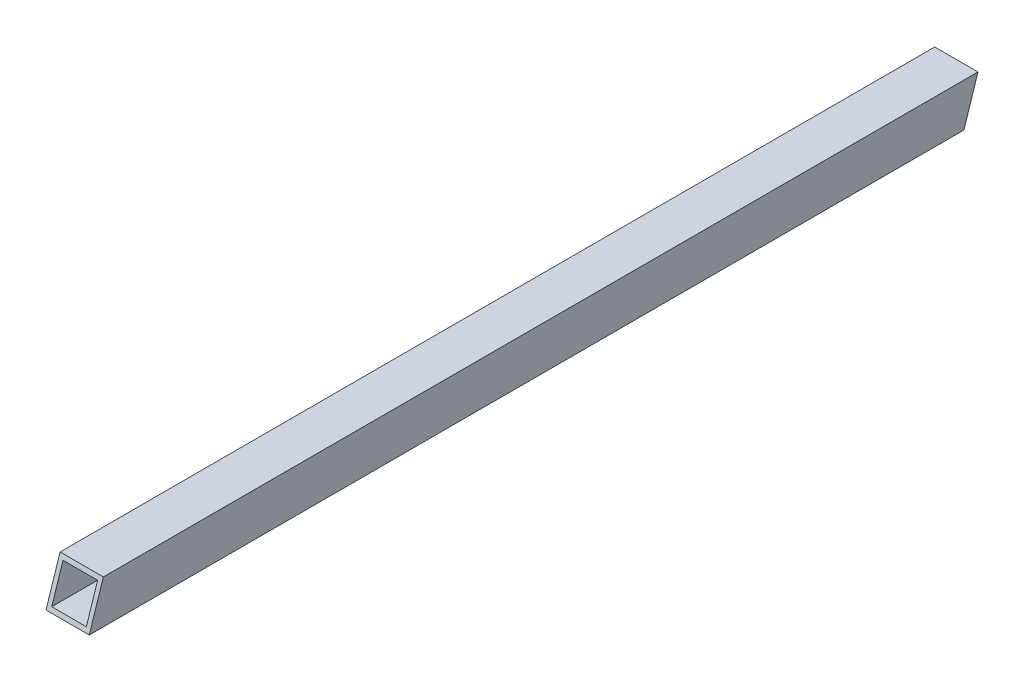
ISO-10303-21;
HEADER;
FILE_DESCRIPTION(('STEP AP214'),'2;1');
FILE_NAME('part.step','',(''),(''),'','','');
FILE_SCHEMA(('AUTOMOTIVE_DESIGN { 1 0 10303 214 1 1 1 1 }'));
ENDSEC;
DATA;
#1=APPLICATION_CONTEXT('core data for automotive mechanical design processes');
#2=APPLICATION_PROTOCOL_DEFINITION('international standard','automotive_design',2000,#1);
#3=PRODUCT_CONTEXT('',#1,'mechanical');
#4=PRODUCT('Part','Part','',(#3));
#5=PRODUCT_RELATED_PRODUCT_CATEGORY('part','',(#4));
#6=PRODUCT_DEFINITION_FORMATION('','',#4);
#7=PRODUCT_DEFINITION_CONTEXT('part definition',#1,'design');
#8=PRODUCT_DEFINITION('design','',#6,#7);
#9=PRODUCT_DEFINITION_SHAPE('','',#8);
#10=(LENGTH_UNIT() NAMED_UNIT(*) SI_UNIT(.MILLI.,.METRE.));
#11=(NAMED_UNIT(*) PLANE_ANGLE_UNIT() SI_UNIT($,.RADIAN.));
#12=(NAMED_UNIT(*) SI_UNIT($,.STERADIAN.) SOLID_ANGLE_UNIT());
#13=UNCERTAINTY_MEASURE_WITH_UNIT(LENGTH_MEASURE(1.E-05),#10,'distance_accuracy_value','');
#14=(GEOMETRIC_REPRESENTATION_CONTEXT(3) GLOBAL_UNCERTAINTY_ASSIGNED_CONTEXT((#13)) GLOBAL_UNIT_ASSIGNED_CONTEXT((#10,
#11,#12)) REPRESENTATION_CONTEXT('',''));
#15=CARTESIAN_POINT('',(0.,0.,0.));
#16=DIRECTION('',(0.,0.,1.));
#17=DIRECTION('',(1.,0.,0.));
#18=AXIS2_PLACEMENT_3D('',#15,#16,#17);
#19=CARTESIAN_POINT('',(0.,0.,0.));
#20=DIRECTION('',(0.,-1.,0.));
#21=DIRECTION('',(0.,0.,-1.));
#22=AXIS2_PLACEMENT_3D('',#19,#20,#21);
#23=PLANE('',#22);
#24=DIRECTION('',(0.,0.,-1.));
#25=VECTOR('',#24,1.);
#26=CARTESIAN_POINT('',(31.75,0.,0.));
#27=LINE('',#26,#25);
#28=CARTESIAN_POINT('',(31.75,0.,652.018));
#29=VERTEX_POINT('',#28);
#30=CARTESIAN_POINT('',(31.75,0.,10.3162003553937));
#31=VERTEX_POINT('',#30);
#32=EDGE_CURVE('E129',#29,#31,#27,.T.);
#33=ORIENTED_EDGE('',*,*,#32,.F.);
#34=DIRECTION('',(1.,0.,0.));
#35=VECTOR('',#34,1.);
#36=CARTESIAN_POINT('',(31.75,0.,652.018));
#37=LINE('',#36,#35);
#38=CARTESIAN_POINT('',(0.,0.,652.018));
#39=VERTEX_POINT('',#38);
#40=EDGE_CURVE('E90',#29,#39,#37,.F.);
#41=ORIENTED_EDGE('',*,*,#40,.T.);
#42=DIRECTION('',(0.,0.,1.));
#43=VECTOR('',#42,1.);
#44=CARTESIAN_POINT('',(0.,0.,0.));
#45=LINE('',#44,#43);
#46=CARTESIAN_POINT('',(0.,0.,10.3162003553937));
#47=VERTEX_POINT('',#46);
#48=EDGE_CURVE('E100',#47,#39,#45,.T.);
#49=ORIENTED_EDGE('',*,*,#48,.F.);
#50=DIRECTION('',(1.,0.,0.));
#51=VECTOR('',#50,1.);
#52=CARTESIAN_POINT('',(31.75,-3.67761376907083E-13,10.3162003553928));
#53=LINE('',#52,#51);
#54=EDGE_CURVE('E136',#47,#31,#53,.T.);
#55=ORIENTED_EDGE('',*,*,#54,.T.);
#56=EDGE_LOOP('',(#33,#41,#49,#55));
#57=FACE_BOUND('',#56,.T.);
#58=ADVANCED_FACE('F17',(#57),#23,.T.);
#59=CARTESIAN_POINT('',(0.,3.175,0.));
#60=DIRECTION('',(0.,-1.,0.));
#61=DIRECTION('',(0.,0.,-1.));
#62=AXIS2_PLACEMENT_3D('',#59,#60,#61);
#63=PLANE('',#62);
#64=DIRECTION('',(1.,0.,0.));
#65=VECTOR('',#64,1.);
#66=CARTESIAN_POINT('',(31.75,3.17500000000897,650.986379964458));
#67=LINE('',#66,#65);
#68=CARTESIAN_POINT('',(3.175,3.17500000000224,650.986379964443));
#69=VERTEX_POINT('',#68);
#70=CARTESIAN_POINT('',(28.575,3.17500000000288,650.986379964443));
#71=VERTEX_POINT('',#70);
#72=EDGE_CURVE('E79',#69,#71,#67,.T.);
#73=ORIENTED_EDGE('',*,*,#72,.T.);
#74=DIRECTION('',(0.,0.,-1.));
#75=VECTOR('',#74,1.);
#76=CARTESIAN_POINT('',(28.575,3.17500000000254,0.));
#77=LINE('',#76,#75);
#78=CARTESIAN_POINT('',(28.575,3.17500000000053,9.28458031985428));
#79=VERTEX_POINT('',#78);
#80=EDGE_CURVE('E82',#71,#79,#77,.T.);
#81=ORIENTED_EDGE('',*,*,#80,.T.);
#82=DIRECTION('',(1.,0.,0.));
#83=VECTOR('',#82,1.);
#84=CARTESIAN_POINT('',(31.75,3.17499999999959,9.28458031985355));
#85=LINE('',#84,#83);
#86=CARTESIAN_POINT('',(3.175,3.1749999999999,9.28458031985449));
#87=VERTEX_POINT('',#86);
#88=EDGE_CURVE('E139',#79,#87,#85,.F.);
#89=ORIENTED_EDGE('',*,*,#88,.T.);
#90=DIRECTION('',(0.,0.,1.));
#91=VECTOR('',#90,1.);
#92=CARTESIAN_POINT('',(3.175,3.175,0.));
#93=LINE('',#92,#91);
#94=EDGE_CURVE('E20',#87,#69,#93,.T.);
#95=ORIENTED_EDGE('',*,*,#94,.T.);
#96=EDGE_LOOP('',(#73,#81,#89,#95));
#97=FACE_BOUND('',#96,.T.);
#98=ADVANCED_FACE('F81',(#97),#63,.F.);
#99=CARTESIAN_POINT('',(3.175,31.75,0.));
#100=DIRECTION('',(-1.,0.,0.));
#101=DIRECTION('',(0.,0.,1.));
#102=AXIS2_PLACEMENT_3D('',#99,#100,#101);
#103=PLANE('',#102);
#104=DIRECTION('',(0.,0.951056516295172,-0.309016994374891));
#105=VECTOR('',#104,1.);
#106=CARTESIAN_POINT('',(3.175,0.,652.018));
#107=LINE('',#106,#105);
#108=CARTESIAN_POINT('',(3.175,28.5749999999964,642.733419680185));
#109=VERTEX_POINT('',#108);
#110=EDGE_CURVE('E108',#109,#69,#107,.F.);
#111=ORIENTED_EDGE('',*,*,#110,.T.);
#112=ORIENTED_EDGE('',*,*,#94,.F.);
#113=DIRECTION('',(0.,-0.951056516295172,0.309016994374891));
#114=VECTOR('',#113,1.);
#115=CARTESIAN_POINT('',(3.175,31.75,0.));
#116=LINE('',#115,#114);
#117=CARTESIAN_POINT('',(3.175,28.575,1.03162003553943));
#118=VERTEX_POINT('',#117);
#119=EDGE_CURVE('E123',#87,#118,#116,.F.);
#120=ORIENTED_EDGE('',*,*,#119,.T.);
#121=DIRECTION('',(0.,0.,1.));
#122=VECTOR('',#121,1.);
#123=CARTESIAN_POINT('',(3.175,28.575,0.));
#124=LINE('',#123,#122);
#125=EDGE_CURVE('E118',#118,#109,#124,.T.);
#126=ORIENTED_EDGE('',*,*,#125,.T.);
#127=EDGE_LOOP('',(#111,#112,#120,#126));
#128=FACE_BOUND('',#127,.T.);
#129=ADVANCED_FACE('F121',(#128),#103,.F.);
#130=CARTESIAN_POINT('',(31.75,28.575,0.));
#131=DIRECTION('',(0.,1.,0.));
#132=DIRECTION('',(0.,0.,1.));
#133=AXIS2_PLACEMENT_3D('',#130,#131,#132);
#134=PLANE('',#133);
#135=DIRECTION('',(1.,0.,0.));
#136=VECTOR('',#135,1.);
#137=CARTESIAN_POINT('',(31.75,28.5749999999855,642.733419680151));
#138=LINE('',#137,#136);
#139=CARTESIAN_POINT('',(28.575,28.5749999999964,642.733419680185));
#140=VERTEX_POINT('',#139);
#141=EDGE_CURVE('E106',#140,#109,#138,.F.);
#142=ORIENTED_EDGE('',*,*,#141,.T.);
#143=ORIENTED_EDGE('',*,*,#125,.F.);
#144=DIRECTION('',(1.,0.,0.));
#145=VECTOR('',#144,1.);
#146=CARTESIAN_POINT('',(31.75,28.575,1.03162003553928));
#147=LINE('',#146,#145);
#148=CARTESIAN_POINT('',(28.575,28.575,1.03162003553956));
#149=VERTEX_POINT('',#148);
#150=EDGE_CURVE('E142',#118,#149,#147,.T.);
#151=ORIENTED_EDGE('',*,*,#150,.T.);
#152=DIRECTION('',(0.,0.,-1.));
#153=VECTOR('',#152,1.);
#154=CARTESIAN_POINT('',(28.575,28.575,0.));
#155=LINE('',#154,#153);
#156=EDGE_CURVE('E101',#149,#140,#155,.F.);
#157=ORIENTED_EDGE('',*,*,#156,.T.);
#158=EDGE_LOOP('',(#142,#143,#151,#157));
#159=FACE_BOUND('',#158,.T.);
#160=ADVANCED_FACE('F126',(#159),#134,.F.);
#161=CARTESIAN_POINT('',(28.575,0.,0.));
#162=DIRECTION('',(1.,0.,0.));
#163=DIRECTION('',(0.,0.,-1.));
#164=AXIS2_PLACEMENT_3D('',#161,#162,#163);
#165=PLANE('',#164);
#166=DIRECTION('',(0.,0.951056516295172,-0.309016994374891));
#167=VECTOR('',#166,1.);
#168=CARTESIAN_POINT('',(28.575,0.,652.018));
#169=LINE('',#168,#167);
#170=EDGE_CURVE('E89',#71,#140,#169,.T.);
#171=ORIENTED_EDGE('',*,*,#170,.T.);
#172=ORIENTED_EDGE('',*,*,#156,.F.);
#173=DIRECTION('',(0.,-0.951056516295172,0.309016994374891));
#174=VECTOR('',#173,1.);
#175=CARTESIAN_POINT('',(28.575,31.75,0.));
#176=LINE('',#175,#174);
#177=EDGE_CURVE('E98',#149,#79,#176,.T.);
#178=ORIENTED_EDGE('',*,*,#177,.T.);
#179=ORIENTED_EDGE('',*,*,#80,.F.);
#180=EDGE_LOOP('',(#171,#172,#178,#179));
#181=FACE_BOUND('',#180,.T.);
#182=ADVANCED_FACE('F94',(#181),#165,.F.);
#183=CARTESIAN_POINT('',(0.,31.75,0.));
#184=DIRECTION('',(-1.,0.,0.));
#185=DIRECTION('',(0.,0.,1.));
#186=AXIS2_PLACEMENT_3D('',#183,#184,#185);
#187=PLANE('',#186);
#188=DIRECTION('',(0.,0.,1.));
#189=VECTOR('',#188,1.);
#190=CARTESIAN_POINT('',(0.,31.75,0.));
#191=LINE('',#190,#189);
#192=CARTESIAN_POINT('',(0.,31.75,0.));
#193=VERTEX_POINT('',#192);
#194=CARTESIAN_POINT('',(0.,31.749999999998,641.701799644628));
#195=VERTEX_POINT('',#194);
#196=EDGE_CURVE('E145',#193,#195,#191,.T.);
#197=ORIENTED_EDGE('',*,*,#196,.F.);
#198=DIRECTION('',(0.,-0.951056516295172,0.309016994374891));
#199=VECTOR('',#198,1.);
#200=CARTESIAN_POINT('',(0.,31.75,0.));
#201=LINE('',#200,#199);
#202=EDGE_CURVE('E133',#193,#47,#201,.T.);
#203=ORIENTED_EDGE('',*,*,#202,.T.);
#204=ORIENTED_EDGE('',*,*,#48,.T.);
#205=DIRECTION('',(0.,0.951056516295172,-0.309016994374891));
#206=VECTOR('',#205,1.);
#207=CARTESIAN_POINT('',(0.,0.,652.018));
#208=LINE('',#207,#206);
#209=EDGE_CURVE('E114',#39,#195,#208,.T.);
#210=ORIENTED_EDGE('',*,*,#209,.T.);
#211=EDGE_LOOP('',(#197,#203,#204,#210));
#212=FACE_BOUND('',#211,.T.);
#213=ADVANCED_FACE('F164',(#212),#187,.T.);
#214=CARTESIAN_POINT('',(31.75,0.,652.018));
#215=DIRECTION('',(0.,-0.309016994374891,-0.951056516295172));
#216=DIRECTION('',(0.,0.951056516295172,-0.309016994374891));
#217=AXIS2_PLACEMENT_3D('',#214,#215,#216);
#218=PLANE('',#217);
#219=ORIENTED_EDGE('',*,*,#141,.F.);
#220=ORIENTED_EDGE('',*,*,#170,.F.);
#221=ORIENTED_EDGE('',*,*,#72,.F.);
#222=ORIENTED_EDGE('',*,*,#110,.F.);
#223=EDGE_LOOP('',(#219,#220,#221,#222));
#224=FACE_BOUND('',#223,.T.);
#225=DIRECTION('',(0.,-0.951056516295407,0.309016994374167));
#226=VECTOR('',#225,1.);
#227=CARTESIAN_POINT('',(31.75,31.75,641.701799644634));
#228=LINE('',#227,#226);
#229=CARTESIAN_POINT('',(31.75,31.7499999999961,641.701799644622));
#230=VERTEX_POINT('',#229);
#231=EDGE_CURVE('E127',#230,#29,#228,.T.);
#232=ORIENTED_EDGE('',*,*,#231,.F.);
#233=DIRECTION('',(1.,0.,0.));
#234=VECTOR('',#233,1.);
#235=CARTESIAN_POINT('',(31.75,31.75,641.701799644634));
#236=LINE('',#235,#234);
#237=EDGE_CURVE('E148',#195,#230,#236,.T.);
#238=ORIENTED_EDGE('',*,*,#237,.F.);
#239=ORIENTED_EDGE('',*,*,#209,.F.);
#240=ORIENTED_EDGE('',*,*,#40,.F.);
#241=EDGE_LOOP('',(#232,#238,#239,#240));
#242=FACE_BOUND('',#241,.T.);
#243=ADVANCED_FACE('F103',(#224,#242),#218,.F.);
#244=CARTESIAN_POINT('',(31.75,0.,0.));
#245=DIRECTION('',(1.,0.,0.));
#246=DIRECTION('',(0.,0.,-1.));
#247=AXIS2_PLACEMENT_3D('',#244,#245,#246);
#248=PLANE('',#247);
#249=ORIENTED_EDGE('',*,*,#32,.T.);
#250=DIRECTION('',(0.,-0.951056516295172,0.309016994374891));
#251=VECTOR('',#250,1.);
#252=CARTESIAN_POINT('',(31.75,31.75,0.));
#253=LINE('',#252,#251);
#254=CARTESIAN_POINT('',(31.75,31.75,0.));
#255=VERTEX_POINT('',#254);
#256=EDGE_CURVE('E35',#31,#255,#253,.F.);
#257=ORIENTED_EDGE('',*,*,#256,.T.);
#258=DIRECTION('',(0.,0.,1.));
#259=VECTOR('',#258,1.);
#260=CARTESIAN_POINT('',(31.75,31.75,0.));
#261=LINE('',#260,#259);
#262=EDGE_CURVE('E26',#230,#255,#261,.F.);
#263=ORIENTED_EDGE('',*,*,#262,.F.);
#264=ORIENTED_EDGE('',*,*,#231,.T.);
#265=EDGE_LOOP('',(#249,#257,#263,#264));
#266=FACE_BOUND('',#265,.T.);
#267=ADVANCED_FACE('F155',(#266),#248,.T.);
#268=CARTESIAN_POINT('',(31.75,31.75,0.));
#269=DIRECTION('',(0.,0.309016994374891,0.951056516295172));
#270=DIRECTION('',(0.,-0.951056516295172,0.309016994374891));
#271=AXIS2_PLACEMENT_3D('',#268,#269,#270);
#272=PLANE('',#271);
#273=ORIENTED_EDGE('',*,*,#150,.F.);
#274=ORIENTED_EDGE('',*,*,#119,.F.);
#275=ORIENTED_EDGE('',*,*,#88,.F.);
#276=ORIENTED_EDGE('',*,*,#177,.F.);
#277=EDGE_LOOP('',(#273,#274,#275,#276));
#278=FACE_BOUND('',#277,.T.);
#279=ORIENTED_EDGE('',*,*,#256,.F.);
#280=ORIENTED_EDGE('',*,*,#54,.F.);
#281=ORIENTED_EDGE('',*,*,#202,.F.);
#282=DIRECTION('',(1.,0.,0.));
#283=VECTOR('',#282,1.);
#284=CARTESIAN_POINT('',(31.75,31.75,0.));
#285=LINE('',#284,#283);
#286=EDGE_CURVE('E11',#255,#193,#285,.F.);
#287=ORIENTED_EDGE('',*,*,#286,.F.);
#288=EDGE_LOOP('',(#279,#280,#281,#287));
#289=FACE_BOUND('',#288,.T.);
#290=ADVANCED_FACE('F162',(#278,#289),#272,.F.);
#291=CARTESIAN_POINT('',(31.75,31.75,0.));
#292=DIRECTION('',(0.,1.,0.));
#293=DIRECTION('',(0.,0.,1.));
#294=AXIS2_PLACEMENT_3D('',#291,#292,#293);
#295=PLANE('',#294);
#296=ORIENTED_EDGE('',*,*,#262,.T.);
#297=ORIENTED_EDGE('',*,*,#286,.T.);
#298=ORIENTED_EDGE('',*,*,#196,.T.);
#299=ORIENTED_EDGE('',*,*,#237,.T.);
#300=EDGE_LOOP('',(#296,#297,#298,#299));
#301=FACE_BOUND('',#300,.T.);
#302=ADVANCED_FACE('F153',(#301),#295,.T.);
#303=CLOSED_SHELL('',(#58,#98,#129,#160,#182,#213,#243,#267,#290,#302));
#304=MANIFOLD_SOLID_BREP('B1',#303);
#305=ADVANCED_BREP_SHAPE_REPRESENTATION('',(#18,#304),#14);
#306=SHAPE_DEFINITION_REPRESENTATION(#9,#305);
ENDSEC;
END-ISO-10303-21;
